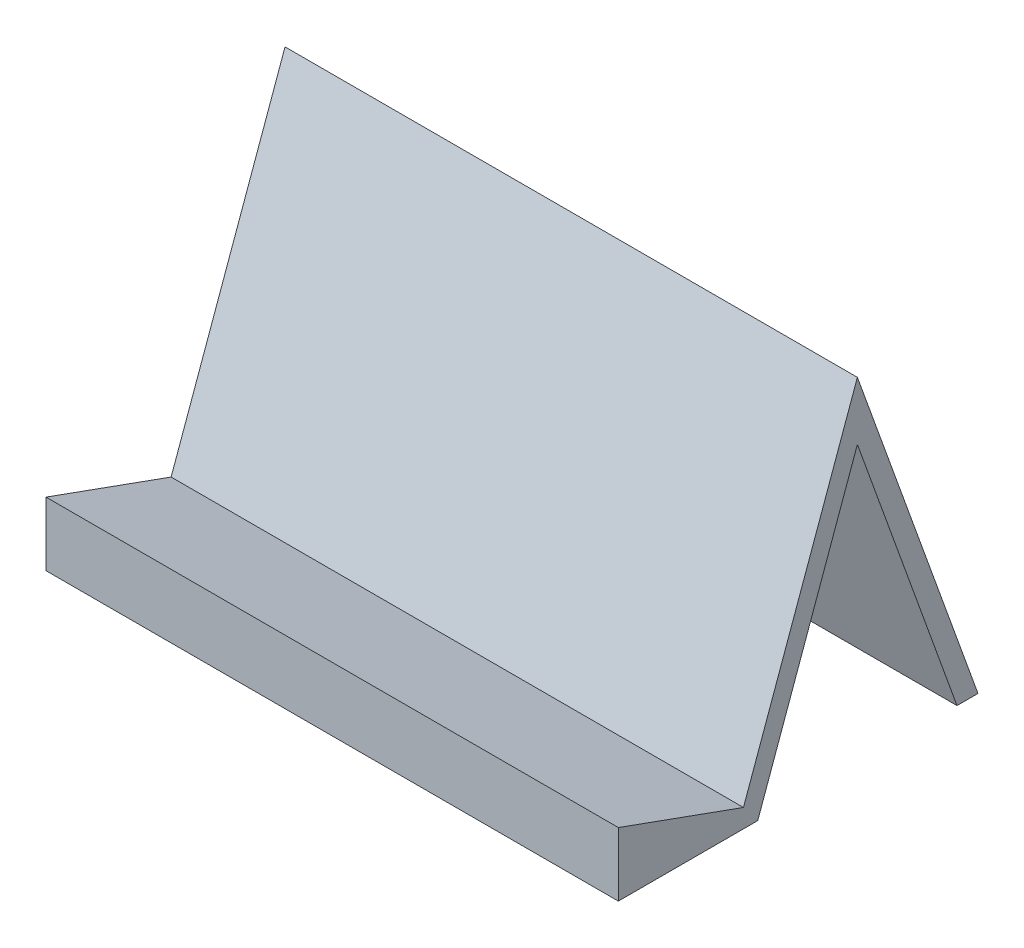
ISO-10303-21;
HEADER;
FILE_DESCRIPTION(('STEP AP214'),'2;1');
FILE_NAME('part.step','',(''),(''),'','','');
FILE_SCHEMA(('AUTOMOTIVE_DESIGN { 1 0 10303 214 1 1 1 1 }'));
ENDSEC;
DATA;
#1=APPLICATION_CONTEXT('core data for automotive mechanical design processes');
#2=APPLICATION_PROTOCOL_DEFINITION('international standard','automotive_design',2000,#1);
#3=PRODUCT_CONTEXT('',#1,'mechanical');
#4=PRODUCT('Part','Part','',(#3));
#5=PRODUCT_RELATED_PRODUCT_CATEGORY('part','',(#4));
#6=PRODUCT_DEFINITION_FORMATION('','',#4);
#7=PRODUCT_DEFINITION_CONTEXT('part definition',#1,'design');
#8=PRODUCT_DEFINITION('design','',#6,#7);
#9=PRODUCT_DEFINITION_SHAPE('','',#8);
#10=(LENGTH_UNIT() NAMED_UNIT(*) SI_UNIT(.MILLI.,.METRE.));
#11=(NAMED_UNIT(*) PLANE_ANGLE_UNIT() SI_UNIT($,.RADIAN.));
#12=(NAMED_UNIT(*) SI_UNIT($,.STERADIAN.) SOLID_ANGLE_UNIT());
#13=UNCERTAINTY_MEASURE_WITH_UNIT(LENGTH_MEASURE(1.E-05),#10,'distance_accuracy_value','');
#14=(GEOMETRIC_REPRESENTATION_CONTEXT(3) GLOBAL_UNCERTAINTY_ASSIGNED_CONTEXT((#13)) GLOBAL_UNIT_ASSIGNED_CONTEXT((#10,
#11,#12)) REPRESENTATION_CONTEXT('',''));
#15=CARTESIAN_POINT('',(0.,0.,0.));
#16=DIRECTION('',(0.,0.,1.));
#17=DIRECTION('',(1.,0.,0.));
#18=AXIS2_PLACEMENT_3D('',#15,#16,#17);
#19=CARTESIAN_POINT('',(46.0375,0.,0.));
#20=DIRECTION('',(0.,1.,0.));
#21=DIRECTION('',(1.,0.,0.));
#22=AXIS2_PLACEMENT_3D('',#19,#20,#21);
#23=PLANE('',#22);
#24=DIRECTION('',(0.,0.,-1.));
#25=VECTOR('',#24,1.);
#26=CARTESIAN_POINT('',(-46.0375,0.,0.));
#27=LINE('',#26,#25);
#28=CARTESIAN_POINT('',(-46.0375,0.,3.37555830950027));
#29=VERTEX_POINT('',#28);
#30=CARTESIAN_POINT('',(-46.0375,0.,0.));
#31=VERTEX_POINT('',#30);
#32=EDGE_CURVE('E10',#29,#31,#27,.T.);
#33=ORIENTED_EDGE('',*,*,#32,.T.);
#34=DIRECTION('',(-1.,0.,0.));
#35=VECTOR('',#34,1.);
#36=CARTESIAN_POINT('',(46.0375,0.,0.));
#37=LINE('',#36,#35);
#38=CARTESIAN_POINT('',(46.0375,0.,0.));
#39=VERTEX_POINT('',#38);
#40=EDGE_CURVE('E42',#39,#31,#37,.T.);
#41=ORIENTED_EDGE('',*,*,#40,.F.);
#42=DIRECTION('',(0.,0.,-1.));
#43=VECTOR('',#42,1.);
#44=CARTESIAN_POINT('',(46.0375,0.,0.));
#45=LINE('',#44,#43);
#46=CARTESIAN_POINT('',(46.0375,0.,3.37555830950027));
#47=VERTEX_POINT('',#46);
#48=EDGE_CURVE('E153',#47,#39,#45,.T.);
#49=ORIENTED_EDGE('',*,*,#48,.F.);
#50=DIRECTION('',(-1.,0.,0.));
#51=VECTOR('',#50,1.);
#52=CARTESIAN_POINT('',(46.0375,0.,3.37555830950027));
#53=LINE('',#52,#51);
#54=EDGE_CURVE('E27',#47,#29,#53,.T.);
#55=ORIENTED_EDGE('',*,*,#54,.T.);
#56=EDGE_LOOP('',(#33,#41,#49,#55));
#57=FACE_BOUND('',#56,.T.);
#58=ADVANCED_FACE('F16',(#57),#23,.F.);
#59=CARTESIAN_POINT('',(46.0375,0.,0.));
#60=DIRECTION('',(0.,-0.339557927485706,0.940585144408316));
#61=DIRECTION('',(-1.,0.,0.));
#62=AXIS2_PLACEMENT_3D('',#59,#60,#61);
#63=PLANE('',#62);
#64=DIRECTION('',(0.,0.940585144408316,0.339557927485706));
#65=VECTOR('',#64,1.);
#66=CARTESIAN_POINT('',(-46.0375,0.,0.));
#67=LINE('',#66,#65);
#68=CARTESIAN_POINT('',(-46.0375,53.7544410029352,19.4057355558081));
#69=VERTEX_POINT('',#68);
#70=EDGE_CURVE('E190',#31,#69,#67,.T.);
#71=ORIENTED_EDGE('',*,*,#70,.T.);
#72=DIRECTION('',(-1.,0.,0.));
#73=VECTOR('',#72,1.);
#74=CARTESIAN_POINT('',(46.0375,53.7544410029352,19.4057355558081));
#75=LINE('',#74,#73);
#76=CARTESIAN_POINT('',(46.0375,53.7544410029352,19.4057355558081));
#77=VERTEX_POINT('',#76);
#78=EDGE_CURVE('E199',#77,#69,#75,.T.);
#79=ORIENTED_EDGE('',*,*,#78,.F.);
#80=DIRECTION('',(0.,0.940585144408316,0.339557927485706));
#81=VECTOR('',#80,1.);
#82=CARTESIAN_POINT('',(46.0375,0.,0.));
#83=LINE('',#82,#81);
#84=EDGE_CURVE('E117',#39,#77,#83,.T.);
#85=ORIENTED_EDGE('',*,*,#84,.F.);
#86=ORIENTED_EDGE('',*,*,#40,.T.);
#87=EDGE_LOOP('',(#71,#79,#85,#86));
#88=FACE_BOUND('',#87,.T.);
#89=ADVANCED_FACE('F18',(#88),#63,.F.);
#90=CARTESIAN_POINT('',(46.0375,53.7544410029352,19.4057355558081));
#91=DIRECTION('',(0.,-0.339557927485706,-0.940585144408316));
#92=DIRECTION('',(0.,-0.940585144408316,0.339557927485706));
#93=AXIS2_PLACEMENT_3D('',#90,#91,#92);
#94=PLANE('',#93);
#95=DIRECTION('',(0.,-0.940585144408316,0.339557927485706));
#96=VECTOR('',#95,1.);
#97=CARTESIAN_POINT('',(-46.0375,53.7544410029352,19.4057355558081));
#98=LINE('',#97,#96);
#99=CARTESIAN_POINT('',(-46.0375,2.9863578334964,37.7333746918491));
#100=VERTEX_POINT('',#99);
#101=EDGE_CURVE('E126',#69,#100,#98,.T.);
#102=ORIENTED_EDGE('',*,*,#101,.T.);
#103=DIRECTION('',(-1.,0.,0.));
#104=VECTOR('',#103,1.);
#105=CARTESIAN_POINT('',(46.0375,2.9863578334964,37.7333746918491));
#106=LINE('',#105,#104);
#107=CARTESIAN_POINT('',(46.0375,2.9863578334964,37.7333746918491));
#108=VERTEX_POINT('',#107);
#109=EDGE_CURVE('E123',#108,#100,#106,.T.);
#110=ORIENTED_EDGE('',*,*,#109,.F.);
#111=DIRECTION('',(0.,-0.940585144408316,0.339557927485706));
#112=VECTOR('',#111,1.);
#113=CARTESIAN_POINT('',(46.0375,53.7544410029352,19.4057355558081));
#114=LINE('',#113,#112);
#115=EDGE_CURVE('E111',#77,#108,#114,.T.);
#116=ORIENTED_EDGE('',*,*,#115,.F.);
#117=ORIENTED_EDGE('',*,*,#78,.T.);
#118=EDGE_LOOP('',(#102,#110,#116,#117));
#119=FACE_BOUND('',#118,.T.);
#120=ADVANCED_FACE('F124',(#119),#94,.F.);
#121=CARTESIAN_POINT('',(46.0375,2.9863578334964,37.7333746918491));
#122=DIRECTION('',(0.,-0.940585144408316,0.339557927485706));
#123=DIRECTION('',(-1.,0.,0.));
#124=AXIS2_PLACEMENT_3D('',#121,#122,#123);
#125=PLANE('',#124);
#126=DIRECTION('',(0.,0.339557927485706,0.940585144408316));
#127=VECTOR('',#126,1.);
#128=CARTESIAN_POINT('',(-46.0375,2.9863578334964,37.7333746918491));
#129=LINE('',#128,#127);
#130=CARTESIAN_POINT('',(-46.0375,10.2527438115867,57.8614711116162));
#131=VERTEX_POINT('',#130);
#132=EDGE_CURVE('E20',#100,#131,#129,.T.);
#133=ORIENTED_EDGE('',*,*,#132,.T.);
#134=DIRECTION('',(-1.,0.,0.));
#135=VECTOR('',#134,1.);
#136=CARTESIAN_POINT('',(46.0375,10.2527438115867,57.8614711116162));
#137=LINE('',#136,#135);
#138=CARTESIAN_POINT('',(46.0375,10.2527438115867,57.8614711116162));
#139=VERTEX_POINT('',#138);
#140=EDGE_CURVE('E134',#139,#131,#137,.T.);
#141=ORIENTED_EDGE('',*,*,#140,.F.);
#142=DIRECTION('',(0.,0.339557927485706,0.940585144408316));
#143=VECTOR('',#142,1.);
#144=CARTESIAN_POINT('',(46.0375,2.9863578334964,37.7333746918491));
#145=LINE('',#144,#143);
#146=EDGE_CURVE('E115',#108,#139,#145,.T.);
#147=ORIENTED_EDGE('',*,*,#146,.F.);
#148=ORIENTED_EDGE('',*,*,#109,.T.);
#149=EDGE_LOOP('',(#133,#141,#147,#148));
#150=FACE_BOUND('',#149,.T.);
#151=ADVANCED_FACE('F133',(#150),#125,.F.);
#152=CARTESIAN_POINT('',(46.0375,10.2527438115867,57.8614711116162));
#153=DIRECTION('',(0.,0.,-1.));
#154=DIRECTION('',(0.,-1.,0.));
#155=AXIS2_PLACEMENT_3D('',#152,#153,#154);
#156=PLANE('',#155);
#157=DIRECTION('',(0.,-1.,0.));
#158=VECTOR('',#157,1.);
#159=CARTESIAN_POINT('',(-46.0375,10.2527438115867,57.8614711116162));
#160=LINE('',#159,#158);
#161=CARTESIAN_POINT('',(-46.0375,0.,57.8614711116162));
#162=VERTEX_POINT('',#161);
#163=EDGE_CURVE('E131',#131,#162,#160,.T.);
#164=ORIENTED_EDGE('',*,*,#163,.T.);
#165=DIRECTION('',(-1.,0.,0.));
#166=VECTOR('',#165,1.);
#167=CARTESIAN_POINT('',(46.0375,0.,57.8614711116162));
#168=LINE('',#167,#166);
#169=CARTESIAN_POINT('',(46.0375,0.,57.8614711116162));
#170=VERTEX_POINT('',#169);
#171=EDGE_CURVE('E148',#170,#162,#168,.T.);
#172=ORIENTED_EDGE('',*,*,#171,.F.);
#173=DIRECTION('',(0.,-1.,0.));
#174=VECTOR('',#173,1.);
#175=CARTESIAN_POINT('',(46.0375,10.2527438115867,57.8614711116162));
#176=LINE('',#175,#174);
#177=EDGE_CURVE('E137',#139,#170,#176,.T.);
#178=ORIENTED_EDGE('',*,*,#177,.F.);
#179=ORIENTED_EDGE('',*,*,#140,.T.);
#180=EDGE_LOOP('',(#164,#172,#178,#179));
#181=FACE_BOUND('',#180,.T.);
#182=ADVANCED_FACE('F214',(#181),#156,.F.);
#183=CARTESIAN_POINT('',(46.0375,0.,35.435912802116));
#184=DIRECTION('',(0.,1.,0.));
#185=DIRECTION('',(0.,0.,-1.));
#186=AXIS2_PLACEMENT_3D('',#183,#184,#185);
#187=PLANE('',#186);
#188=DIRECTION('',(0.,0.,-1.));
#189=VECTOR('',#188,1.);
#190=CARTESIAN_POINT('',(-46.0375,0.,35.435912802116));
#191=LINE('',#190,#189);
#192=CARTESIAN_POINT('',(-46.0375,0.,35.435912802116));
#193=VERTEX_POINT('',#192);
#194=EDGE_CURVE('E145',#162,#193,#191,.T.);
#195=ORIENTED_EDGE('',*,*,#194,.T.);
#196=DIRECTION('',(-1.,0.,0.));
#197=VECTOR('',#196,1.);
#198=CARTESIAN_POINT('',(46.0375,0.,35.435912802116));
#199=LINE('',#198,#197);
#200=CARTESIAN_POINT('',(46.0375,0.,35.435912802116));
#201=VERTEX_POINT('',#200);
#202=EDGE_CURVE('E101',#201,#193,#199,.T.);
#203=ORIENTED_EDGE('',*,*,#202,.F.);
#204=DIRECTION('',(0.,0.,-1.));
#205=VECTOR('',#204,1.);
#206=CARTESIAN_POINT('',(46.0375,0.,38.8114711116162));
#207=LINE('',#206,#205);
#208=EDGE_CURVE('E89',#170,#201,#207,.T.);
#209=ORIENTED_EDGE('',*,*,#208,.F.);
#210=ORIENTED_EDGE('',*,*,#171,.T.);
#211=EDGE_LOOP('',(#195,#203,#209,#210));
#212=FACE_BOUND('',#211,.T.);
#213=ADVANCED_FACE('F220',(#212),#187,.F.);
#214=CARTESIAN_POINT('',(46.0375,44.404048203952,19.4057355558081));
#215=DIRECTION('',(0.,0.339557927485706,0.940585144408316));
#216=DIRECTION('',(1.,0.,0.));
#217=AXIS2_PLACEMENT_3D('',#214,#215,#216);
#218=PLANE('',#217);
#219=DIRECTION('',(0.,0.940585144408316,-0.339557927485706));
#220=VECTOR('',#219,1.);
#221=CARTESIAN_POINT('',(-46.0375,44.404048203952,19.4057355558081));
#222=LINE('',#221,#220);
#223=CARTESIAN_POINT('',(-46.0375,44.404048203952,19.4057355558081));
#224=VERTEX_POINT('',#223);
#225=EDGE_CURVE('E166',#193,#224,#222,.T.);
#226=ORIENTED_EDGE('',*,*,#225,.T.);
#227=DIRECTION('',(-1.,0.,0.));
#228=VECTOR('',#227,1.);
#229=CARTESIAN_POINT('',(46.0375,44.404048203952,19.4057355558081));
#230=LINE('',#229,#228);
#231=CARTESIAN_POINT('',(46.0375,44.404048203952,19.4057355558081));
#232=VERTEX_POINT('',#231);
#233=EDGE_CURVE('E149',#232,#224,#230,.T.);
#234=ORIENTED_EDGE('',*,*,#233,.F.);
#235=DIRECTION('',(0.,0.940585144408316,-0.339557927485706));
#236=VECTOR('',#235,1.);
#237=CARTESIAN_POINT('',(46.0375,44.404048203952,19.4057355558081));
#238=LINE('',#237,#236);
#239=EDGE_CURVE('E177',#201,#232,#238,.T.);
#240=ORIENTED_EDGE('',*,*,#239,.F.);
#241=ORIENTED_EDGE('',*,*,#202,.T.);
#242=EDGE_LOOP('',(#226,#234,#240,#241));
#243=FACE_BOUND('',#242,.T.);
#244=ADVANCED_FACE('F267',(#243),#218,.F.);
#245=CARTESIAN_POINT('',(46.0375,0.,3.37555830950027));
#246=DIRECTION('',(0.,0.339557927485706,-0.940585144408316));
#247=DIRECTION('',(-1.,0.,0.));
#248=AXIS2_PLACEMENT_3D('',#245,#246,#247);
#249=PLANE('',#248);
#250=DIRECTION('',(0.,-0.940585144408316,-0.339557927485706));
#251=VECTOR('',#250,1.);
#252=CARTESIAN_POINT('',(-46.0375,0.,3.37555830950027));
#253=LINE('',#252,#251);
#254=EDGE_CURVE('E152',#224,#29,#253,.T.);
#255=ORIENTED_EDGE('',*,*,#254,.T.);
#256=ORIENTED_EDGE('',*,*,#54,.F.);
#257=DIRECTION('',(0.,-0.940585144408316,-0.339557927485706));
#258=VECTOR('',#257,1.);
#259=CARTESIAN_POINT('',(46.0375,0.,3.37555830950027));
#260=LINE('',#259,#258);
#261=EDGE_CURVE('E178',#232,#47,#260,.T.);
#262=ORIENTED_EDGE('',*,*,#261,.F.);
#263=ORIENTED_EDGE('',*,*,#233,.T.);
#264=EDGE_LOOP('',(#255,#256,#262,#263));
#265=FACE_BOUND('',#264,.T.);
#266=ADVANCED_FACE('F186',(#265),#249,.F.);
#267=CARTESIAN_POINT('',(46.0375,0.,0.));
#268=DIRECTION('',(1.,0.,0.));
#269=DIRECTION('',(0.,1.,0.));
#270=AXIS2_PLACEMENT_3D('',#267,#268,#269);
#271=PLANE('',#270);
#272=ORIENTED_EDGE('',*,*,#48,.T.);
#273=ORIENTED_EDGE('',*,*,#84,.T.);
#274=ORIENTED_EDGE('',*,*,#115,.T.);
#275=ORIENTED_EDGE('',*,*,#146,.T.);
#276=ORIENTED_EDGE('',*,*,#177,.T.);
#277=ORIENTED_EDGE('',*,*,#208,.T.);
#278=ORIENTED_EDGE('',*,*,#239,.T.);
#279=ORIENTED_EDGE('',*,*,#261,.T.);
#280=EDGE_LOOP('',(#272,#273,#274,#275,#276,#277,#278,#279));
#281=FACE_BOUND('',#280,.T.);
#282=ADVANCED_FACE('F113',(#281),#271,.T.);
#283=CARTESIAN_POINT('',(-46.0375,0.,0.));
#284=DIRECTION('',(1.,0.,0.));
#285=DIRECTION('',(0.,1.,0.));
#286=AXIS2_PLACEMENT_3D('',#283,#284,#285);
#287=PLANE('',#286);
#288=ORIENTED_EDGE('',*,*,#32,.F.);
#289=ORIENTED_EDGE('',*,*,#254,.F.);
#290=ORIENTED_EDGE('',*,*,#225,.F.);
#291=ORIENTED_EDGE('',*,*,#194,.F.);
#292=ORIENTED_EDGE('',*,*,#163,.F.);
#293=ORIENTED_EDGE('',*,*,#132,.F.);
#294=ORIENTED_EDGE('',*,*,#101,.F.);
#295=ORIENTED_EDGE('',*,*,#70,.F.);
#296=EDGE_LOOP('',(#288,#289,#290,#291,#292,#293,#294,#295));
#297=FACE_BOUND('',#296,.T.);
#298=ADVANCED_FACE('F218',(#297),#287,.F.);
#299=CLOSED_SHELL('',(#58,#89,#120,#151,#182,#213,#244,#266,#282,#298));
#300=MANIFOLD_SOLID_BREP('B1',#299);
#301=ADVANCED_BREP_SHAPE_REPRESENTATION('',(#18,#300),#14);
#302=SHAPE_DEFINITION_REPRESENTATION(#9,#301);
ENDSEC;
END-ISO-10303-21;
